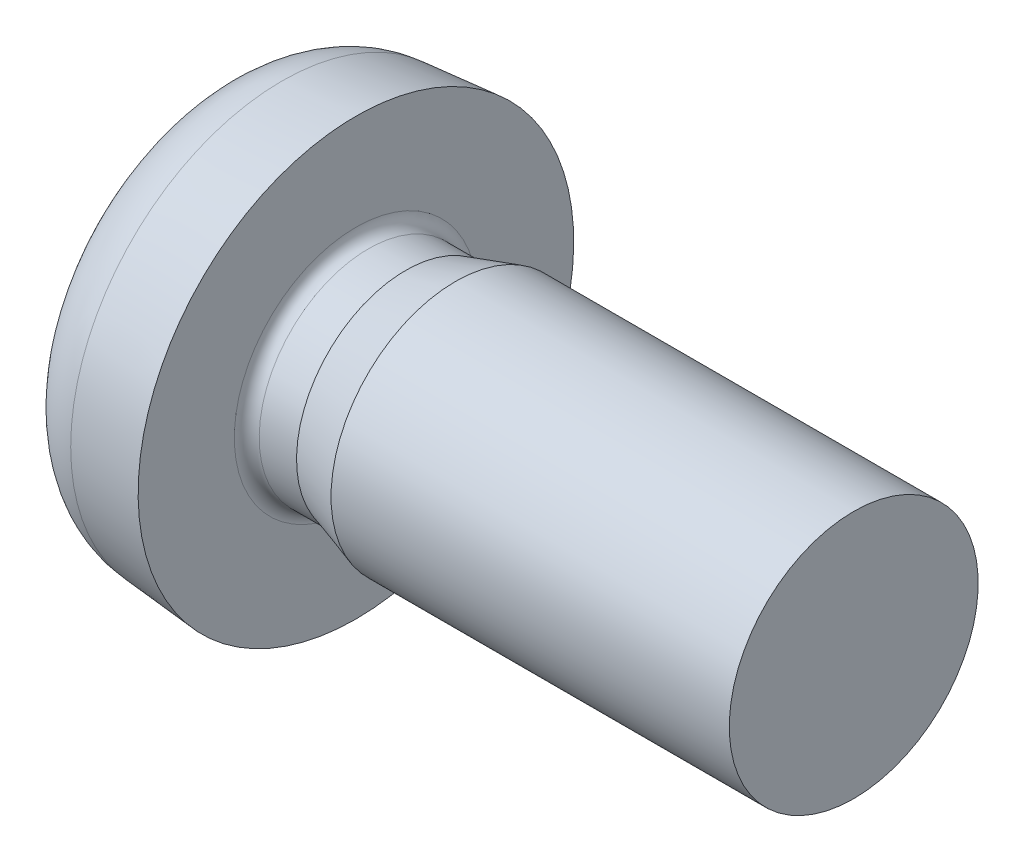
ISO-10303-21;
HEADER;
FILE_DESCRIPTION(('STEP AP214'),'2;1');
FILE_NAME('part.step','',(''),(''),'','','');
FILE_SCHEMA(('AUTOMOTIVE_DESIGN { 1 0 10303 214 1 1 1 1 }'));
ENDSEC;
DATA;
#1=APPLICATION_CONTEXT('core data for automotive mechanical design processes');
#2=APPLICATION_PROTOCOL_DEFINITION('international standard','automotive_design',2000,#1);
#3=PRODUCT_CONTEXT('',#1,'mechanical');
#4=PRODUCT('Part','Part','',(#3));
#5=PRODUCT_RELATED_PRODUCT_CATEGORY('part','',(#4));
#6=PRODUCT_DEFINITION_FORMATION('','',#4);
#7=PRODUCT_DEFINITION_CONTEXT('part definition',#1,'design');
#8=PRODUCT_DEFINITION('design','',#6,#7);
#9=PRODUCT_DEFINITION_SHAPE('','',#8);
#10=(LENGTH_UNIT() NAMED_UNIT(*) SI_UNIT(.MILLI.,.METRE.));
#11=(NAMED_UNIT(*) PLANE_ANGLE_UNIT() SI_UNIT($,.RADIAN.));
#12=(NAMED_UNIT(*) SI_UNIT($,.STERADIAN.) SOLID_ANGLE_UNIT());
#13=UNCERTAINTY_MEASURE_WITH_UNIT(LENGTH_MEASURE(1.E-05),#10,'distance_accuracy_value','');
#14=(GEOMETRIC_REPRESENTATION_CONTEXT(3) GLOBAL_UNCERTAINTY_ASSIGNED_CONTEXT((#13)) GLOBAL_UNIT_ASSIGNED_CONTEXT((#10,
#11,#12)) REPRESENTATION_CONTEXT('',''));
#15=CARTESIAN_POINT('',(0.,0.,0.));
#16=DIRECTION('',(0.,0.,1.));
#17=DIRECTION('',(1.,0.,0.));
#18=AXIS2_PLACEMENT_3D('',#15,#16,#17);
#19=CARTESIAN_POINT('',(-0.3,0.4,-0.23333333333333));
#20=DIRECTION('',(-1.,0.,0.));
#21=DIRECTION('',(0.,0.,1.));
#22=AXIS2_PLACEMENT_3D('',#19,#20,#21);
#23=PLANE('',#22);
#24=CARTESIAN_POINT('',(-0.3,0.,0.));
#25=DIRECTION('',(-1.,0.,0.));
#26=DIRECTION('',(0.,0.,1.));
#27=AXIS2_PLACEMENT_3D('',#24,#25,#26);
#28=CIRCLE('',#27,0.41489922506576);
#29=CARTESIAN_POINT('',(-0.300000000000007,0.110187871202621,0.400000000000005));
#30=VERTEX_POINT('',#29);
#31=CARTESIAN_POINT('',(-0.3,0.233333333333331,0.343069850782206));
#32=VERTEX_POINT('',#31);
#33=EDGE_CURVE('E434',#30,#32,#28,.T.);
#34=ORIENTED_EDGE('',*,*,#33,.F.);
#35=CARTESIAN_POINT('',(-0.299999999999999,0.233333333333331,0.400000000000001));
#36=DIRECTION('',(0.,-1.,0.));
#37=VECTOR('',#36,1.);
#38=LINE('',#35,#37);
#39=CARTESIAN_POINT('',(-0.3,0.233333333333332,0.4));
#40=VERTEX_POINT('',#39);
#41=EDGE_CURVE('E436',#40,#30,#38,.T.);
#42=ORIENTED_EDGE('',*,*,#41,.F.);
#43=CARTESIAN_POINT('',(-0.3,0.233333333333331,0.34306985078241));
#44=DIRECTION('',(0.,0.,1.));
#45=VECTOR('',#44,1.);
#46=LINE('',#43,#45);
#47=EDGE_CURVE('E437',#32,#40,#46,.T.);
#48=ORIENTED_EDGE('',*,*,#47,.F.);
#49=EDGE_LOOP('',(#34,#42,#48));
#50=FACE_BOUND('',#49,.T.);
#51=ADVANCED_FACE('F17',(#50),#23,.T.);
#52=CARTESIAN_POINT('',(-0.300000000000013,0.343069850782208,0.23333333333333));
#53=VERTEX_POINT('',#52);
#54=CARTESIAN_POINT('',(-0.3,0.400000000038284,0.11018787106366));
#55=VERTEX_POINT('',#54);
#56=EDGE_CURVE('E641',#53,#55,#28,.T.);
#57=ORIENTED_EDGE('',*,*,#56,.F.);
#58=CARTESIAN_POINT('',(-0.3,0.4,0.23333333333333));
#59=DIRECTION('',(0.,-1.,0.));
#60=VECTOR('',#59,1.);
#61=LINE('',#58,#60);
#62=CARTESIAN_POINT('',(-0.3,0.4,0.23333333333333));
#63=VERTEX_POINT('',#62);
#64=EDGE_CURVE('E533',#63,#53,#61,.T.);
#65=ORIENTED_EDGE('',*,*,#64,.F.);
#66=CARTESIAN_POINT('',(-0.300000000000001,0.400000000000001,0.110187871053114));
#67=DIRECTION('',(0.,0.,1.));
#68=VECTOR('',#67,1.);
#69=LINE('',#66,#68);
#70=EDGE_CURVE('E548',#55,#63,#69,.T.);
#71=ORIENTED_EDGE('',*,*,#70,.F.);
#72=EDGE_LOOP('',(#57,#65,#71));
#73=FACE_BOUND('',#72,.T.);
#74=ADVANCED_FACE('F424',(#73),#23,.T.);
#75=CARTESIAN_POINT('',(-0.300000000037748,0.400000000026424,-0.110187871119148));
#76=VERTEX_POINT('',#75);
#77=CARTESIAN_POINT('',(-0.3,0.343069850782207,-0.23333333333333));
#78=VERTEX_POINT('',#77);
#79=EDGE_CURVE('E642',#76,#78,#28,.T.);
#80=ORIENTED_EDGE('',*,*,#79,.F.);
#81=CARTESIAN_POINT('',(-0.300000000000001,0.400000000000001,-0.23333333333333));
#82=DIRECTION('',(0.,0.,1.));
#83=VECTOR('',#82,1.);
#84=LINE('',#81,#83);
#85=CARTESIAN_POINT('',(-0.3,0.4,-0.23333333333333));
#86=VERTEX_POINT('',#85);
#87=EDGE_CURVE('E541',#86,#76,#84,.T.);
#88=ORIENTED_EDGE('',*,*,#87,.F.);
#89=CARTESIAN_POINT('',(-0.3,0.343069850782207,-0.23333333333333));
#90=DIRECTION('',(0.,1.,0.));
#91=VECTOR('',#90,1.);
#92=LINE('',#89,#91);
#93=EDGE_CURVE('E317',#78,#86,#92,.T.);
#94=ORIENTED_EDGE('',*,*,#93,.F.);
#95=EDGE_LOOP('',(#80,#88,#94));
#96=FACE_BOUND('',#95,.T.);
#97=ADVANCED_FACE('F430',(#96),#23,.T.);
#98=CARTESIAN_POINT('',(-0.3,0.233333333333329,-0.343069850782208));
#99=VERTEX_POINT('',#98);
#100=CARTESIAN_POINT('',(-0.3,0.110187871202632,-0.4));
#101=VERTEX_POINT('',#100);
#102=EDGE_CURVE('E654',#99,#101,#28,.T.);
#103=ORIENTED_EDGE('',*,*,#102,.F.);
#104=CARTESIAN_POINT('',(-0.3,0.233333333333329,-0.400000000000001));
#105=DIRECTION('',(0.,0.,1.));
#106=VECTOR('',#105,1.);
#107=LINE('',#104,#106);
#108=CARTESIAN_POINT('',(-0.3,0.233333333333329,-0.4));
#109=VERTEX_POINT('',#108);
#110=EDGE_CURVE('E472',#109,#99,#107,.T.);
#111=ORIENTED_EDGE('',*,*,#110,.F.);
#112=CARTESIAN_POINT('',(-0.300000000000001,0.110187871202633,-0.400000000000002));
#113=DIRECTION('',(0.,1.,0.));
#114=VECTOR('',#113,1.);
#115=LINE('',#112,#114);
#116=EDGE_CURVE('E176',#101,#109,#115,.T.);
#117=ORIENTED_EDGE('',*,*,#116,.F.);
#118=EDGE_LOOP('',(#103,#111,#117));
#119=FACE_BOUND('',#118,.T.);
#120=ADVANCED_FACE('F659',(#119),#23,.T.);
#121=CARTESIAN_POINT('',(-0.3,-0.110187871202431,-0.400000000000056));
#122=VERTEX_POINT('',#121);
#123=CARTESIAN_POINT('',(-0.30000000000002,-0.233333333333332,-0.343069850782208));
#124=VERTEX_POINT('',#123);
#125=EDGE_CURVE('E591',#122,#124,#28,.T.);
#126=ORIENTED_EDGE('',*,*,#125,.F.);
#127=CARTESIAN_POINT('',(-0.300000000000001,-0.233333333333331,-0.400000000000001));
#128=DIRECTION('',(0.,1.,0.));
#129=VECTOR('',#128,1.);
#130=LINE('',#127,#129);
#131=CARTESIAN_POINT('',(-0.3,-0.233333333333332,-0.4));
#132=VERTEX_POINT('',#131);
#133=EDGE_CURVE('E589',#132,#122,#130,.T.);
#134=ORIENTED_EDGE('',*,*,#133,.F.);
#135=CARTESIAN_POINT('',(-0.3,-0.233333333333331,-0.343069850782409));
#136=DIRECTION('',(0.,0.,-1.));
#137=VECTOR('',#136,1.);
#138=LINE('',#135,#137);
#139=EDGE_CURVE('E177',#124,#132,#138,.T.);
#140=ORIENTED_EDGE('',*,*,#139,.F.);
#141=EDGE_LOOP('',(#126,#134,#140));
#142=FACE_BOUND('',#141,.T.);
#143=ADVANCED_FACE('F590',(#142),#23,.T.);
#144=CARTESIAN_POINT('',(-0.3,-0.343069850782207,-0.23333333333333));
#145=VERTEX_POINT('',#144);
#146=CARTESIAN_POINT('',(-0.300000000000011,-0.400000000000008,-0.11018787120261));
#147=VERTEX_POINT('',#146);
#148=EDGE_CURVE('E638',#145,#147,#28,.T.);
#149=ORIENTED_EDGE('',*,*,#148,.F.);
#150=CARTESIAN_POINT('',(-0.3,-0.4,-0.23333333333333));
#151=DIRECTION('',(0.,1.,0.));
#152=VECTOR('',#151,1.);
#153=LINE('',#150,#152);
#154=CARTESIAN_POINT('',(-0.3,-0.4,-0.23333333333333));
#155=VERTEX_POINT('',#154);
#156=EDGE_CURVE('E553',#155,#145,#153,.T.);
#157=ORIENTED_EDGE('',*,*,#156,.F.);
#158=CARTESIAN_POINT('',(-0.300000000000001,-0.400000000000001,-0.110187871053114));
#159=DIRECTION('',(0.,0.,-1.));
#160=VECTOR('',#159,1.);
#161=LINE('',#158,#160);
#162=EDGE_CURVE('E529',#147,#155,#161,.T.);
#163=ORIENTED_EDGE('',*,*,#162,.F.);
#164=EDGE_LOOP('',(#149,#157,#163));
#165=FACE_BOUND('',#164,.T.);
#166=ADVANCED_FACE('F750',(#165),#23,.T.);
#167=CARTESIAN_POINT('',(-0.3,-0.400000000000057,0.11018787120243));
#168=VERTEX_POINT('',#167);
#169=CARTESIAN_POINT('',(-0.30000000000002,-0.343069850782209,0.23333333333333));
#170=VERTEX_POINT('',#169);
#171=EDGE_CURVE('E619',#168,#170,#28,.T.);
#172=ORIENTED_EDGE('',*,*,#171,.F.);
#173=CARTESIAN_POINT('',(-0.300000000000001,-0.400000000000001,0.23333333333333));
#174=DIRECTION('',(0.,0.,-1.));
#175=VECTOR('',#174,1.);
#176=LINE('',#173,#175);
#177=CARTESIAN_POINT('',(-0.3,-0.4,0.23333333333333));
#178=VERTEX_POINT('',#177);
#179=EDGE_CURVE('E525',#178,#168,#176,.T.);
#180=ORIENTED_EDGE('',*,*,#179,.F.);
#181=CARTESIAN_POINT('',(-0.3,-0.343069850782207,0.23333333333333));
#182=DIRECTION('',(0.,-1.,0.));
#183=VECTOR('',#182,1.);
#184=LINE('',#181,#183);
#185=EDGE_CURVE('E535',#170,#178,#184,.T.);
#186=ORIENTED_EDGE('',*,*,#185,.F.);
#187=EDGE_LOOP('',(#172,#180,#186));
#188=FACE_BOUND('',#187,.T.);
#189=ADVANCED_FACE('F342',(#188),#23,.T.);
#190=CARTESIAN_POINT('',(0.271428571428572,0.,0.23333333333333));
#191=DIRECTION('',(0.,0.,1.));
#192=DIRECTION('',(1.,0.,0.));
#193=AXIS2_PLACEMENT_3D('',#190,#191,#192);
#194=PLANE('',#193);
#195=ORIENTED_EDGE('',*,*,#64,.T.);
#196=CARTESIAN_POINT('',(-0.2997,0.343038108403994,0.23333333333333));
#197=CARTESIAN_POINT('',(-0.426200518487948,0.356413169292468,0.23333333333333));
#198=CARTESIAN_POINT('',(-0.552724537571043,0.369562838851567,0.23333333333333));
#199=CARTESIAN_POINT('',(-0.805808804996358,0.395504275504335,0.23333333333333));
#200=CARTESIAN_POINT('',(-0.932369053194846,0.408296043998559,0.23333333333333));
#201=CARTESIAN_POINT('',(-1.13532721935039,0.428595006281568,0.23333333333333));
#202=CARTESIAN_POINT('',(-1.21171672944914,0.436186419234913,0.23333333333333));
#203=CARTESIAN_POINT('',(-1.28810992623331,0.44373980396504,0.23333333333333));
#204=B_SPLINE_CURVE_WITH_KNOTS('',3,(#196,#197,#198,#199,#200,#201,#202,#203),.UNSPECIFIED.,.F.,
.F.,(4,2,2,4),(0.,0.381616218749478,0.763230943932751,0.993528205938742),.UNSPECIFIED.);
#205=CARTESIAN_POINT('',(-1.27214147961395,0.442160764736997,0.23333333333333));
#206=VERTEX_POINT('',#205);
#207=EDGE_CURVE('E649',#53,#206,#204,.T.);
#208=ORIENTED_EDGE('',*,*,#207,.T.);
#209=CARTESIAN_POINT('',(3.19999999999751,0.,0.23333333333333));
#210=DIRECTION('',(0.,0.,1.));
#211=DIRECTION('',(1.,0.,0.));
#212=AXIS2_PLACEMENT_3D('',#209,#210,#211);
#213=CIRCLE('',#212,4.49394654569168);
#214=CARTESIAN_POINT('',(-1.17792712457823,1.01454898720476,0.23333333333333));
#215=VERTEX_POINT('',#214);
#216=EDGE_CURVE('E492',#215,#206,#213,.T.);
#217=ORIENTED_EDGE('',*,*,#216,.F.);
#218=DIRECTION('',(-0.81923192051904,0.573462344363328,0.));
#219=VECTOR('',#218,1.);
#220=CARTESIAN_POINT('',(-0.3,0.4,0.23333333333333));
#221=LINE('',#220,#219);
#222=EDGE_CURVE('E556',#63,#215,#221,.T.);
#223=ORIENTED_EDGE('',*,*,#222,.F.);
#224=EDGE_LOOP('',(#195,#208,#217,#223));
#225=FACE_BOUND('',#224,.T.);
#226=ADVANCED_FACE('F661',(#225),#194,.F.);
#227=CARTESIAN_POINT('',(0.271428571428572,0.,-0.23333333333333));
#228=DIRECTION('',(0.,0.,-1.));
#229=DIRECTION('',(-1.,0.,0.));
#230=AXIS2_PLACEMENT_3D('',#227,#228,#229);
#231=PLANE('',#230);
#232=CARTESIAN_POINT('',(3.19999999999751,0.,-0.23333333333333));
#233=DIRECTION('',(0.,0.,-1.));
#234=DIRECTION('',(-1.,0.,0.));
#235=AXIS2_PLACEMENT_3D('',#232,#233,#234);
#236=CIRCLE('',#235,4.49394654569168);
#237=CARTESIAN_POINT('',(-1.27214147961393,0.442160764737084,-0.23333333333333));
#238=VERTEX_POINT('',#237);
#239=CARTESIAN_POINT('',(-1.17792712457823,1.01454898720476,-0.23333333333333));
#240=VERTEX_POINT('',#239);
#241=EDGE_CURVE('E499',#238,#240,#236,.T.);
#242=ORIENTED_EDGE('',*,*,#241,.F.);
#243=CARTESIAN_POINT('',(-1.28810992623331,0.44373980396504,-0.23333333333333));
#244=CARTESIAN_POINT('',(-1.20571743140864,0.435594808395287,-0.23333333333333));
#245=CARTESIAN_POINT('',(-1.12332951598812,0.427403221854397,-0.23333333333333));
#246=CARTESIAN_POINT('',(-0.958565391565636,0.410905577220105,-0.23333333333333));
#247=CARTESIAN_POINT('',(-0.876189182530653,0.402599519456286,-0.23333333333333));
#248=CARTESIAN_POINT('',(-0.711450476951214,0.385851589291033,-0.23333333333333));
#249=CARTESIAN_POINT('',(-0.629087980417993,0.37740971677886,-0.23333333333333));
#250=CARTESIAN_POINT('',(-0.464380151721125,0.360357960412237,-0.23333333333333));
#251=CARTESIAN_POINT('',(-0.38203481960775,0.351748076072497,-0.23333333333333));
#252=CARTESIAN_POINT('',(-0.299699999999289,0.343038108411188,-0.23333333333333));
#253=B_SPLINE_CURVE_WITH_KNOTS('',3,(#243,#244,#245,#246,#247,#248,#249,#250,#251,#252),
.UNSPECIFIED.,.F.,.F.,(4,2,2,2,4),(0.,0.248382344578916,0.496763974168754,0.7451458062906,
0.99352835595135),.UNSPECIFIED.);
#254=EDGE_CURVE('E278',#238,#78,#253,.T.);
#255=ORIENTED_EDGE('',*,*,#254,.T.);
#256=ORIENTED_EDGE('',*,*,#93,.T.);
#257=DIRECTION('',(-0.81923192051904,0.573462344363328,0.));
#258=VECTOR('',#257,1.);
#259=CARTESIAN_POINT('',(-0.3,0.4,-0.23333333333333));
#260=LINE('',#259,#258);
#261=EDGE_CURVE('E557',#86,#240,#260,.T.);
#262=ORIENTED_EDGE('',*,*,#261,.T.);
#263=EDGE_LOOP('',(#242,#255,#256,#262));
#264=FACE_BOUND('',#263,.T.);
#265=ADVANCED_FACE('F289',(#264),#231,.F.);
#266=CARTESIAN_POINT('',(3.19999999999751,0.,0.));
#267=DIRECTION('',(-1.,0.,0.));
#268=DIRECTION('',(0.,1.,0.));
#269=AXIS2_PLACEMENT_3D('',#266,#267,#268);
#270=SPHERICAL_SURFACE('',#269,4.49999999999762);
#271=CARTESIAN_POINT('',(3.19999999999751,0.23333333333333,0.));
#272=DIRECTION('',(0.,1.,0.));
#273=DIRECTION('',(0.,0.,1.));
#274=AXIS2_PLACEMENT_3D('',#271,#272,#273);
#275=CIRCLE('',#274,4.49394654569168);
#276=CARTESIAN_POINT('',(-1.17792712457823,0.233333333333327,-1.01454898720476));
#277=VERTEX_POINT('',#276);
#278=CARTESIAN_POINT('',(-1.27214147961395,0.233333333333329,-0.442160764736998));
#279=VERTEX_POINT('',#278);
#280=EDGE_CURVE('E598',#277,#279,#275,.T.);
#281=ORIENTED_EDGE('',*,*,#280,.T.);
#282=CARTESIAN_POINT('',(-1.27214147961395,0.,0.));
#283=DIRECTION('',(1.,0.,0.));
#284=DIRECTION('',(0.,0.,-1.));
#285=AXIS2_PLACEMENT_3D('',#282,#283,#284);
#286=CIRCLE('',#285,0.499950583875296);
#287=EDGE_CURVE('E644',#279,#238,#286,.T.);
#288=ORIENTED_EDGE('',*,*,#287,.T.);
#289=ORIENTED_EDGE('',*,*,#241,.T.);
#290=CARTESIAN_POINT('',(2.23691275167617,-1.37583892617332,0.));
#291=DIRECTION('',(0.573462344363328,0.819231920519041,0.));
#292=DIRECTION('',(-0.81923192051904,0.573462344363328,0.));
#293=AXIS2_PLACEMENT_3D('',#290,#291,#292);
#294=CIRCLE('',#293,4.17486888432747);
#295=EDGE_CURVE('E489',#240,#215,#294,.T.);
#296=ORIENTED_EDGE('',*,*,#295,.T.);
#297=ORIENTED_EDGE('',*,*,#216,.T.);
#298=CARTESIAN_POINT('',(-1.27214147961393,0.233333333333332,0.442160764737084));
#299=VERTEX_POINT('',#298);
#300=EDGE_CURVE('E622',#206,#299,#286,.T.);
#301=ORIENTED_EDGE('',*,*,#300,.T.);
#302=CARTESIAN_POINT('',(-1.17792712457823,0.233333333333334,1.01454898720476));
#303=VERTEX_POINT('',#302);
#304=EDGE_CURVE('E602',#299,#303,#275,.T.);
#305=ORIENTED_EDGE('',*,*,#304,.T.);
#306=CARTESIAN_POINT('',(2.23691275167617,0.,-1.37583892617332));
#307=DIRECTION('',(0.573462344363328,0.,0.819231920519041));
#308=DIRECTION('',(0.819231920519041,0.,-0.573462344363328));
#309=AXIS2_PLACEMENT_3D('',#306,#307,#308);
#310=CIRCLE('',#309,4.17486888432747);
#311=CARTESIAN_POINT('',(-1.17792712457823,-0.233333333333327,1.01454898720476));
#312=VERTEX_POINT('',#311);
#313=EDGE_CURVE('E486',#303,#312,#310,.T.);
#314=ORIENTED_EDGE('',*,*,#313,.T.);
#315=CARTESIAN_POINT('',(3.19999999999751,-0.23333333333333,0.));
#316=DIRECTION('',(0.,-1.,0.));
#317=DIRECTION('',(0.,0.,-1.));
#318=AXIS2_PLACEMENT_3D('',#315,#316,#317);
#319=CIRCLE('',#318,4.49394654569168);
#320=CARTESIAN_POINT('',(-1.27214147961403,-0.233333333333329,0.442160764736266));
#321=VERTEX_POINT('',#320);
#322=EDGE_CURVE('E601',#312,#321,#319,.T.);
#323=ORIENTED_EDGE('',*,*,#322,.T.);
#324=CARTESIAN_POINT('',(-1.27214147961395,-0.442160764736998,0.23333333333333));
#325=VERTEX_POINT('',#324);
#326=EDGE_CURVE('E35',#321,#325,#286,.T.);
#327=ORIENTED_EDGE('',*,*,#326,.T.);
#328=CARTESIAN_POINT('',(-1.17792712457823,-1.01454898720476,0.23333333333333));
#329=VERTEX_POINT('',#328);
#330=EDGE_CURVE('E495',#325,#329,#213,.T.);
#331=ORIENTED_EDGE('',*,*,#330,.T.);
#332=CARTESIAN_POINT('',(2.23691275167617,1.37583892617332,0.));
#333=DIRECTION('',(0.573462344363328,-0.819231920519041,0.));
#334=DIRECTION('',(0.81923192051904,0.573462344363328,0.));
#335=AXIS2_PLACEMENT_3D('',#332,#333,#334);
#336=CIRCLE('',#335,4.17486888432747);
#337=CARTESIAN_POINT('',(-1.17792712457823,-1.01454898720476,-0.23333333333333));
#338=VERTEX_POINT('',#337);
#339=EDGE_CURVE('E500',#329,#338,#336,.T.);
#340=ORIENTED_EDGE('',*,*,#339,.T.);
#341=CARTESIAN_POINT('',(-1.27214147961393,-0.442160764737084,-0.23333333333333));
#342=VERTEX_POINT('',#341);
#343=EDGE_CURVE('E496',#338,#342,#236,.T.);
#344=ORIENTED_EDGE('',*,*,#343,.T.);
#345=CARTESIAN_POINT('',(-1.27214147961395,-0.233333333333332,-0.442160764736996));
#346=VERTEX_POINT('',#345);
#347=EDGE_CURVE('E600',#342,#346,#286,.T.);
#348=ORIENTED_EDGE('',*,*,#347,.T.);
#349=CARTESIAN_POINT('',(-1.17792712457823,-0.233333333333334,-1.01454898720476));
#350=VERTEX_POINT('',#349);
#351=EDGE_CURVE('E186',#346,#350,#319,.T.);
#352=ORIENTED_EDGE('',*,*,#351,.T.);
#353=CARTESIAN_POINT('',(2.23691275167617,0.,1.37583892617332));
#354=DIRECTION('',(0.573462344363329,0.,-0.819231920519041));
#355=DIRECTION('',(-0.819231920519041,0.,-0.573462344363329));
#356=AXIS2_PLACEMENT_3D('',#353,#354,#355);
#357=CIRCLE('',#356,4.17486888432747);
#358=EDGE_CURVE('E27',#350,#277,#357,.T.);
#359=ORIENTED_EDGE('',*,*,#358,.T.);
#360=EDGE_LOOP('',(#281,#288,#289,#296,#297,#301,#305,#314,#323,#327,#331,#340,#344,#348,#352,#359));
#361=FACE_BOUND('',#360,.T.);
#362=CARTESIAN_POINT('',(-1.1171858241993,0.,0.));
#363=DIRECTION('',(-1.,0.,0.));
#364=DIRECTION('',(0.,-1.,0.));
#365=AXIS2_PLACEMENT_3D('',#362,#363,#364);
#366=CIRCLE('',#365,1.2696088213827);
#367=CARTESIAN_POINT('',(-1.1171858241993,-1.2696088213827,0.));
#368=VERTEX_POINT('',#367);
#369=EDGE_CURVE('E503',#368,#368,#366,.T.);
#370=ORIENTED_EDGE('',*,*,#369,.T.);
#371=EDGE_LOOP('',(#370));
#372=FACE_BOUND('',#371,.T.);
#373=ADVANCED_FACE('F19',(#361,#372),#270,.T.);
#374=CARTESIAN_POINT('',(-0.541561047639255,0.,0.));
#375=DIRECTION('',(-1.,0.,0.));
#376=DIRECTION('',(0.,-1.,0.));
#377=AXIS2_PLACEMENT_3D('',#374,#375,#376);
#378=TOROIDAL_SURFACE('',#377,1.10032764519818,0.600000000000179);
#379=ORIENTED_EDGE('',*,*,#369,.F.);
#380=EDGE_LOOP('',(#379));
#381=FACE_BOUND('',#380,.T.);
#382=CARTESIAN_POINT('',(-0.593854493287836,0.,0.));
#383=DIRECTION('',(-1.,0.,0.));
#384=DIRECTION('',(0.,-1.,0.));
#385=AXIS2_PLACEMENT_3D('',#382,#383,#384);
#386=CIRCLE('',#385,1.69804446405341);
#387=CARTESIAN_POINT('',(-0.593854493287836,-1.69804446405342,0.));
#388=VERTEX_POINT('',#387);
#389=EDGE_CURVE('E506',#388,#388,#386,.T.);
#390=ORIENTED_EDGE('',*,*,#389,.T.);
#391=EDGE_LOOP('',(#390));
#392=FACE_BOUND('',#391,.T.);
#393=ADVANCED_FACE('F733',(#381,#392),#378,.T.);
#394=CARTESIAN_POINT('',(0.,0.,0.));
#395=DIRECTION('',(1.,0.,0.));
#396=DIRECTION('',(0.,1.,0.));
#397=AXIS2_PLACEMENT_3D('',#394,#395,#396);
#398=CONICAL_SURFACE('',#397,1.75,0.0872664625996655);
#399=ORIENTED_EDGE('',*,*,#389,.F.);
#400=EDGE_LOOP('',(#399));
#401=FACE_BOUND('',#400,.T.);
#402=CARTESIAN_POINT('',(0.,0.,0.));
#403=DIRECTION('',(-1.,0.,0.));
#404=DIRECTION('',(0.,-1.,0.));
#405=AXIS2_PLACEMENT_3D('',#402,#403,#404);
#406=CIRCLE('',#405,1.75);
#407=CARTESIAN_POINT('',(0.,-1.75,0.));
#408=VERTEX_POINT('',#407);
#409=EDGE_CURVE('E509',#408,#408,#406,.T.);
#410=ORIENTED_EDGE('',*,*,#409,.T.);
#411=EDGE_LOOP('',(#410));
#412=FACE_BOUND('',#411,.T.);
#413=ADVANCED_FACE('F756',(#401,#412),#398,.T.);
#414=CARTESIAN_POINT('',(0.,1.75,0.));
#415=DIRECTION('',(-1.,0.,0.));
#416=DIRECTION('',(0.,-1.,0.));
#417=AXIS2_PLACEMENT_3D('',#414,#415,#416);
#418=PLANE('',#417);
#419=ORIENTED_EDGE('',*,*,#409,.F.);
#420=EDGE_LOOP('',(#419));
#421=FACE_BOUND('',#420,.T.);
#422=CARTESIAN_POINT('',(0.,0.,0.));
#423=DIRECTION('',(-1.,0.,0.));
#424=DIRECTION('',(0.,-1.,0.));
#425=AXIS2_PLACEMENT_3D('',#422,#423,#424);
#426=CIRCLE('',#425,0.977250000000021);
#427=CARTESIAN_POINT('',(0.,-0.977250000000022,0.));
#428=VERTEX_POINT('',#427);
#429=EDGE_CURVE('E512',#428,#428,#426,.T.);
#430=ORIENTED_EDGE('',*,*,#429,.T.);
#431=EDGE_LOOP('',(#430));
#432=FACE_BOUND('',#431,.T.);
#433=ADVANCED_FACE('F763',(#421,#432),#418,.F.);
#434=CARTESIAN_POINT('',(0.0999999999999905,0.,0.));
#435=DIRECTION('',(-1.,0.,0.));
#436=DIRECTION('',(0.,-1.,0.));
#437=AXIS2_PLACEMENT_3D('',#434,#435,#436);
#438=TOROIDAL_SURFACE('',#437,0.977250000000011,0.0999999999999904);
#439=ORIENTED_EDGE('',*,*,#429,.F.);
#440=EDGE_LOOP('',(#439));
#441=FACE_BOUND('',#440,.T.);
#442=CARTESIAN_POINT('',(0.0999999999999981,0.,0.));
#443=DIRECTION('',(-1.,0.,0.));
#444=DIRECTION('',(0.,-1.,0.));
#445=AXIS2_PLACEMENT_3D('',#442,#443,#444);
#446=CIRCLE('',#445,0.877250000000021);
#447=CARTESIAN_POINT('',(0.0999999999999982,-0.877250000000022,0.));
#448=VERTEX_POINT('',#447);
#449=EDGE_CURVE('E515',#448,#448,#446,.T.);
#450=ORIENTED_EDGE('',*,*,#449,.T.);
#451=EDGE_LOOP('',(#450));
#452=FACE_BOUND('',#451,.T.);
#453=ADVANCED_FACE('F771',(#441,#452),#438,.F.);
#454=CARTESIAN_POINT('',(4.,0.,0.));
#455=DIRECTION('',(-1.,0.,0.));
#456=DIRECTION('',(0.,-1.,0.));
#457=AXIS2_PLACEMENT_3D('',#454,#455,#456);
#458=CYLINDRICAL_SURFACE('',#457,0.877250000000016);
#459=ORIENTED_EDGE('',*,*,#449,.F.);
#460=EDGE_LOOP('',(#459));
#461=FACE_BOUND('',#460,.T.);
#462=CARTESIAN_POINT('',(0.40000000000002,0.,0.));
#463=DIRECTION('',(-1.,0.,0.));
#464=DIRECTION('',(0.,-1.,0.));
#465=AXIS2_PLACEMENT_3D('',#462,#463,#464);
#466=CIRCLE('',#465,0.877250000000011);
#467=CARTESIAN_POINT('',(0.40000000000002,-0.877250000000012,0.));
#468=VERTEX_POINT('',#467);
#469=EDGE_CURVE('E518',#468,#468,#466,.T.);
#470=ORIENTED_EDGE('',*,*,#469,.T.);
#471=EDGE_LOOP('',(#470));
#472=FACE_BOUND('',#471,.T.);
#473=ADVANCED_FACE('F779',(#461,#472),#458,.T.);
#474=CARTESIAN_POINT('',(0.8,0.,0.));
#475=DIRECTION('',(1.,0.,0.));
#476=DIRECTION('',(0.,1.,0.));
#477=AXIS2_PLACEMENT_3D('',#474,#475,#476);
#478=CONICAL_SURFACE('',#477,1.,0.297752138542782);
#479=ORIENTED_EDGE('',*,*,#469,.F.);
#480=EDGE_LOOP('',(#479));
#481=FACE_BOUND('',#480,.T.);
#482=CARTESIAN_POINT('',(0.8,0.,0.));
#483=DIRECTION('',(-1.,0.,0.));
#484=DIRECTION('',(0.,-1.,0.));
#485=AXIS2_PLACEMENT_3D('',#482,#483,#484);
#486=CIRCLE('',#485,1.);
#487=CARTESIAN_POINT('',(0.8,-1.,0.));
#488=VERTEX_POINT('',#487);
#489=EDGE_CURVE('E520',#488,#488,#486,.T.);
#490=ORIENTED_EDGE('',*,*,#489,.T.);
#491=EDGE_LOOP('',(#490));
#492=FACE_BOUND('',#491,.T.);
#493=ADVANCED_FACE('F787',(#481,#492),#478,.T.);
#494=CARTESIAN_POINT('',(4.,0.,0.));
#495=DIRECTION('',(-1.,0.,0.));
#496=DIRECTION('',(0.,-1.,0.));
#497=AXIS2_PLACEMENT_3D('',#494,#495,#496);
#498=CYLINDRICAL_SURFACE('',#497,1.);
#499=ORIENTED_EDGE('',*,*,#489,.F.);
#500=EDGE_LOOP('',(#499));
#501=FACE_BOUND('',#500,.T.);
#502=CARTESIAN_POINT('',(4.,0.,0.));
#503=DIRECTION('',(-1.,0.,0.));
#504=DIRECTION('',(0.,-1.,0.));
#505=AXIS2_PLACEMENT_3D('',#502,#503,#504);
#506=CIRCLE('',#505,1.);
#507=CARTESIAN_POINT('',(4.,-1.,0.));
#508=VERTEX_POINT('',#507);
#509=EDGE_CURVE('E331',#508,#508,#506,.T.);
#510=ORIENTED_EDGE('',*,*,#509,.T.);
#511=EDGE_LOOP('',(#510));
#512=FACE_BOUND('',#511,.T.);
#513=ADVANCED_FACE('F795',(#501,#512),#498,.T.);
#514=CARTESIAN_POINT('',(4.,1.,0.));
#515=DIRECTION('',(-1.,0.,0.));
#516=DIRECTION('',(0.,-1.,0.));
#517=AXIS2_PLACEMENT_3D('',#514,#515,#516);
#518=PLANE('',#517);
#519=ORIENTED_EDGE('',*,*,#509,.F.);
#520=EDGE_LOOP('',(#519));
#521=FACE_BOUND('',#520,.T.);
#522=ADVANCED_FACE('F726',(#521),#518,.F.);
#523=CARTESIAN_POINT('',(-1.3,1.1,-0.23333333333333));
#524=DIRECTION('',(0.573462344363328,0.819231920519041,0.));
#525=DIRECTION('',(-0.81923192051904,0.573462344363328,0.));
#526=AXIS2_PLACEMENT_3D('',#523,#524,#525);
#527=PLANE('',#526);
#528=ORIENTED_EDGE('',*,*,#87,.T.);
#529=CARTESIAN_POINT('',(0.205241374074472,0.0463310381478698,0.));
#530=DIRECTION('',(0.573462344363328,0.819231920519041,0.));
#531=DIRECTION('',(-0.819231920519041,0.573462344363328,0.));
#532=AXIS2_PLACEMENT_3D('',#529,#530,#531);
#533=ELLIPSE('',#532,0.64641791415536,0.367789621693797);
#534=EDGE_CURVE('E643',#76,#55,#533,.T.);
#535=ORIENTED_EDGE('',*,*,#534,.T.);
#536=ORIENTED_EDGE('',*,*,#70,.T.);
#537=ORIENTED_EDGE('',*,*,#222,.T.);
#538=ORIENTED_EDGE('',*,*,#295,.F.);
#539=ORIENTED_EDGE('',*,*,#261,.F.);
#540=EDGE_LOOP('',(#528,#535,#536,#537,#538,#539));
#541=FACE_BOUND('',#540,.T.);
#542=ADVANCED_FACE('F343',(#541),#527,.F.);
#543=ORIENTED_EDGE('',*,*,#330,.F.);
#544=CARTESIAN_POINT('',(-1.28810992623331,-0.44373980396504,0.23333333333333));
#545=CARTESIAN_POINT('',(-1.20571743140864,-0.435594808395286,0.23333333333333));
#546=CARTESIAN_POINT('',(-1.12332951598812,-0.427403221854397,0.23333333333333));
#547=CARTESIAN_POINT('',(-0.958565391565636,-0.410905577220105,0.23333333333333));
#548=CARTESIAN_POINT('',(-0.876189182530653,-0.402599519456286,0.23333333333333));
#549=CARTESIAN_POINT('',(-0.711450476951214,-0.385851589291033,0.23333333333333));
#550=CARTESIAN_POINT('',(-0.629087980417993,-0.37740971677886,0.23333333333333));
#551=CARTESIAN_POINT('',(-0.464380151721125,-0.360357960412237,0.23333333333333));
#552=CARTESIAN_POINT('',(-0.38203481960775,-0.351748076072497,0.23333333333333));
#553=CARTESIAN_POINT('',(-0.299699999999289,-0.343038108411188,0.23333333333333));
#554=B_SPLINE_CURVE_WITH_KNOTS('',3,(#544,#545,#546,#547,#548,#549,#550,#551,#552,#553),
.UNSPECIFIED.,.F.,.F.,(4,2,2,2,4),(0.,0.248382344578916,0.496763974168754,0.7451458062906,
0.99352835595135),.UNSPECIFIED.);
#555=EDGE_CURVE('E439',#325,#170,#554,.T.);
#556=ORIENTED_EDGE('',*,*,#555,.T.);
#557=ORIENTED_EDGE('',*,*,#185,.T.);
#558=DIRECTION('',(-0.81923192051904,-0.573462344363328,0.));
#559=VECTOR('',#558,1.);
#560=CARTESIAN_POINT('',(-0.3,-0.4,0.23333333333333));
#561=LINE('',#560,#559);
#562=EDGE_CURVE('E603',#178,#329,#561,.T.);
#563=ORIENTED_EDGE('',*,*,#562,.T.);
#564=EDGE_LOOP('',(#543,#556,#557,#563));
#565=FACE_BOUND('',#564,.T.);
#566=ADVANCED_FACE('F287',(#565),#194,.F.);
#567=ORIENTED_EDGE('',*,*,#156,.T.);
#568=CARTESIAN_POINT('',(-0.2997,-0.343038108403994,-0.23333333333333));
#569=CARTESIAN_POINT('',(-0.426200518487948,-0.356413169292469,-0.23333333333333));
#570=CARTESIAN_POINT('',(-0.552724537571043,-0.369562838851567,-0.23333333333333));
#571=CARTESIAN_POINT('',(-0.805808804996358,-0.395504275504335,-0.23333333333333));
#572=CARTESIAN_POINT('',(-0.932369053194846,-0.408296043998559,-0.23333333333333));
#573=CARTESIAN_POINT('',(-1.13532721935039,-0.428595006281567,-0.23333333333333));
#574=CARTESIAN_POINT('',(-1.21171672944914,-0.436186419234912,-0.23333333333333));
#575=CARTESIAN_POINT('',(-1.28810992623331,-0.44373980396504,-0.23333333333333));
#576=B_SPLINE_CURVE_WITH_KNOTS('',3,(#568,#569,#570,#571,#572,#573,#574,#575),.UNSPECIFIED.,.F.,
.F.,(4,2,2,4),(0.,0.381616218749478,0.763230943932751,0.993528205938742),.UNSPECIFIED.);
#577=EDGE_CURVE('E647',#145,#342,#576,.T.);
#578=ORIENTED_EDGE('',*,*,#577,.T.);
#579=ORIENTED_EDGE('',*,*,#343,.F.);
#580=DIRECTION('',(-0.81923192051904,-0.573462344363328,0.));
#581=VECTOR('',#580,1.);
#582=CARTESIAN_POINT('',(-0.3,-0.4,-0.23333333333333));
#583=LINE('',#582,#581);
#584=EDGE_CURVE('E42',#155,#338,#583,.T.);
#585=ORIENTED_EDGE('',*,*,#584,.F.);
#586=EDGE_LOOP('',(#567,#578,#579,#585));
#587=FACE_BOUND('',#586,.T.);
#588=ADVANCED_FACE('F282',(#587),#231,.F.);
#589=CARTESIAN_POINT('',(-1.3,-1.1,0.23333333333333));
#590=DIRECTION('',(0.573462344363328,-0.819231920519041,0.));
#591=DIRECTION('',(0.81923192051904,0.573462344363328,0.));
#592=AXIS2_PLACEMENT_3D('',#589,#590,#591);
#593=PLANE('',#592);
#594=ORIENTED_EDGE('',*,*,#179,.T.);
#595=CARTESIAN_POINT('',(0.205241374074472,-0.0463310381478698,0.));
#596=DIRECTION('',(0.573462344363328,-0.819231920519041,0.));
#597=DIRECTION('',(-0.819231920519041,-0.573462344363328,0.));
#598=AXIS2_PLACEMENT_3D('',#595,#596,#597);
#599=ELLIPSE('',#598,0.64641791415536,0.367789621693797);
#600=EDGE_CURVE('E620',#168,#147,#599,.T.);
#601=ORIENTED_EDGE('',*,*,#600,.T.);
#602=ORIENTED_EDGE('',*,*,#162,.T.);
#603=ORIENTED_EDGE('',*,*,#584,.T.);
#604=ORIENTED_EDGE('',*,*,#339,.F.);
#605=ORIENTED_EDGE('',*,*,#562,.F.);
#606=EDGE_LOOP('',(#594,#601,#602,#603,#604,#605));
#607=FACE_BOUND('',#606,.T.);
#608=ADVANCED_FACE('F286',(#607),#593,.F.);
#609=CARTESIAN_POINT('',(-0.300000000000013,-0.233333333333329,0.343069850782209));
#610=VERTEX_POINT('',#609);
#611=CARTESIAN_POINT('',(-0.3,-0.110187871063659,0.400000000038284));
#612=VERTEX_POINT('',#611);
#613=EDGE_CURVE('E156',#610,#612,#28,.T.);
#614=ORIENTED_EDGE('',*,*,#613,.F.);
#615=CARTESIAN_POINT('',(-0.3,-0.233333333333329,0.400000000000001));
#616=DIRECTION('',(0.,0.,-1.));
#617=VECTOR('',#616,1.);
#618=LINE('',#615,#617);
#619=CARTESIAN_POINT('',(-0.3,-0.233333333333329,0.4));
#620=VERTEX_POINT('',#619);
#621=EDGE_CURVE('E165',#620,#610,#618,.T.);
#622=ORIENTED_EDGE('',*,*,#621,.F.);
#623=CARTESIAN_POINT('',(-0.299999999999999,-0.110187871202602,0.400000000000002));
#624=DIRECTION('',(0.,-1.,0.));
#625=VECTOR('',#624,1.);
#626=LINE('',#623,#625);
#627=EDGE_CURVE('E168',#612,#620,#626,.T.);
#628=ORIENTED_EDGE('',*,*,#627,.F.);
#629=EDGE_LOOP('',(#614,#622,#628));
#630=FACE_BOUND('',#629,.T.);
#631=ADVANCED_FACE('F164',(#630),#23,.T.);
#632=CARTESIAN_POINT('',(0.271428571428572,0.23333333333333,0.));
#633=DIRECTION('',(0.,1.,0.));
#634=DIRECTION('',(1.,0.,0.));
#635=AXIS2_PLACEMENT_3D('',#632,#633,#634);
#636=PLANE('',#635);
#637=ORIENTED_EDGE('',*,*,#110,.T.);
#638=CARTESIAN_POINT('',(-0.2997,0.233333333333329,-0.343038108403995));
#639=CARTESIAN_POINT('',(-0.426200518487948,0.233333333333329,-0.356413169292469));
#640=CARTESIAN_POINT('',(-0.552724537571044,0.233333333333329,-0.369562838851568));
#641=CARTESIAN_POINT('',(-0.805808804996358,0.233333333333329,-0.395504275504336));
#642=CARTESIAN_POINT('',(-0.932369053194846,0.233333333333329,-0.40829604399856));
#643=CARTESIAN_POINT('',(-1.13532721935039,0.233333333333328,-0.428595006281568));
#644=CARTESIAN_POINT('',(-1.21171672944914,0.233333333333328,-0.436186419234913));
#645=CARTESIAN_POINT('',(-1.28810992623331,0.233333333333329,-0.443739803965042));
#646=B_SPLINE_CURVE_WITH_KNOTS('',3,(#638,#639,#640,#641,#642,#643,#644,#645),.UNSPECIFIED.,.F.,
.F.,(4,2,2,4),(0.,0.381616218749478,0.763230943932751,0.993528205938742),.UNSPECIFIED.);
#647=EDGE_CURVE('E462',#99,#279,#646,.T.);
#648=ORIENTED_EDGE('',*,*,#647,.T.);
#649=ORIENTED_EDGE('',*,*,#280,.F.);
#650=DIRECTION('',(-0.81923192051904,0.,-0.573462344363328));
#651=VECTOR('',#650,1.);
#652=CARTESIAN_POINT('',(-0.3,0.233333333333329,-0.4));
#653=LINE('',#652,#651);
#654=EDGE_CURVE('E588',#109,#277,#653,.T.);
#655=ORIENTED_EDGE('',*,*,#654,.F.);
#656=EDGE_LOOP('',(#637,#648,#649,#655));
#657=FACE_BOUND('',#656,.T.);
#658=ADVANCED_FACE('F341',(#657),#636,.F.);
#659=CARTESIAN_POINT('',(0.271428571428572,-0.23333333333333,0.));
#660=DIRECTION('',(0.,-1.,0.));
#661=DIRECTION('',(-1.,0.,0.));
#662=AXIS2_PLACEMENT_3D('',#659,#660,#661);
#663=PLANE('',#662);
#664=ORIENTED_EDGE('',*,*,#351,.F.);
#665=CARTESIAN_POINT('',(-1.28810992623331,-0.233333333333332,-0.44373980396504));
#666=CARTESIAN_POINT('',(-1.20571743140864,-0.233333333333332,-0.435594808395286));
#667=CARTESIAN_POINT('',(-1.12332951598812,-0.233333333333332,-0.427403221854396));
#668=CARTESIAN_POINT('',(-0.958565391565636,-0.233333333333332,-0.410905577220104));
#669=CARTESIAN_POINT('',(-0.876189182530653,-0.233333333333332,-0.402599519456285));
#670=CARTESIAN_POINT('',(-0.711450476951214,-0.233333333333331,-0.385851589291032));
#671=CARTESIAN_POINT('',(-0.629087980417993,-0.233333333333331,-0.377409716778859));
#672=CARTESIAN_POINT('',(-0.464380151721125,-0.233333333333331,-0.360357960412236));
#673=CARTESIAN_POINT('',(-0.38203481960775,-0.233333333333331,-0.351748076072496));
#674=CARTESIAN_POINT('',(-0.299699999999289,-0.233333333333332,-0.343038108411188));
#675=B_SPLINE_CURVE_WITH_KNOTS('',3,(#665,#666,#667,#668,#669,#670,#671,#672,#673,#674),
.UNSPECIFIED.,.F.,.F.,(4,2,2,2,4),(0.,0.248382344578916,0.496763974168754,0.745145806290599,
0.99352835595135),.UNSPECIFIED.);
#676=EDGE_CURVE('E587',#346,#124,#675,.T.);
#677=ORIENTED_EDGE('',*,*,#676,.T.);
#678=ORIENTED_EDGE('',*,*,#139,.T.);
#679=DIRECTION('',(-0.81923192051904,0.,-0.573462344363328));
#680=VECTOR('',#679,1.);
#681=CARTESIAN_POINT('',(-0.3,-0.233333333333332,-0.4));
#682=LINE('',#681,#680);
#683=EDGE_CURVE('E405',#132,#350,#682,.T.);
#684=ORIENTED_EDGE('',*,*,#683,.T.);
#685=EDGE_LOOP('',(#664,#677,#678,#684));
#686=FACE_BOUND('',#685,.T.);
#687=ADVANCED_FACE('F198',(#686),#663,.F.);
#688=CARTESIAN_POINT('',(-1.3,-0.233333333333334,-1.1));
#689=DIRECTION('',(0.573462344363329,0.,-0.819231920519041));
#690=DIRECTION('',(-0.81923192051904,0.,-0.573462344363328));
#691=AXIS2_PLACEMENT_3D('',#688,#689,#690);
#692=PLANE('',#691);
#693=ORIENTED_EDGE('',*,*,#133,.T.);
#694=CARTESIAN_POINT('',(0.205241374074472,0.,-0.0463310381478698));
#695=DIRECTION('',(0.573462344363329,0.,-0.819231920519041));
#696=DIRECTION('',(-0.819231920519041,0.,-0.573462344363329));
#697=AXIS2_PLACEMENT_3D('',#694,#695,#696);
#698=ELLIPSE('',#697,0.64641791415536,0.367789621693797);
#699=EDGE_CURVE('E280',#122,#101,#698,.T.);
#700=ORIENTED_EDGE('',*,*,#699,.T.);
#701=ORIENTED_EDGE('',*,*,#116,.T.);
#702=ORIENTED_EDGE('',*,*,#654,.T.);
#703=ORIENTED_EDGE('',*,*,#358,.F.);
#704=ORIENTED_EDGE('',*,*,#683,.F.);
#705=EDGE_LOOP('',(#693,#700,#701,#702,#703,#704));
#706=FACE_BOUND('',#705,.T.);
#707=ADVANCED_FACE('F407',(#706),#692,.F.);
#708=CARTESIAN_POINT('',(-1.3,0.233333333333334,1.1));
#709=DIRECTION('',(0.573462344363328,0.,0.819231920519041));
#710=DIRECTION('',(0.819231920519041,0.,-0.573462344363328));
#711=AXIS2_PLACEMENT_3D('',#708,#709,#710);
#712=PLANE('',#711);
#713=ORIENTED_EDGE('',*,*,#41,.T.);
#714=CARTESIAN_POINT('',(0.205241374074471,0.,0.0463310381478698));
#715=DIRECTION('',(0.573462344363328,0.,0.819231920519041));
#716=DIRECTION('',(-0.819231920519041,0.,0.573462344363328));
#717=AXIS2_PLACEMENT_3D('',#714,#715,#716);
#718=ELLIPSE('',#717,0.64641791415536,0.367789621693797);
#719=EDGE_CURVE('E440',#30,#612,#718,.T.);
#720=ORIENTED_EDGE('',*,*,#719,.T.);
#721=ORIENTED_EDGE('',*,*,#627,.T.);
#722=DIRECTION('',(-0.819231920519041,0.,0.573462344363328));
#723=VECTOR('',#722,1.);
#724=CARTESIAN_POINT('',(-0.3,-0.233333333333329,0.4));
#725=LINE('',#724,#723);
#726=EDGE_CURVE('E175',#620,#312,#725,.T.);
#727=ORIENTED_EDGE('',*,*,#726,.T.);
#728=ORIENTED_EDGE('',*,*,#313,.F.);
#729=DIRECTION('',(-0.819231920519041,0.,0.573462344363328));
#730=VECTOR('',#729,1.);
#731=CARTESIAN_POINT('',(-0.3,0.233333333333332,0.4));
#732=LINE('',#731,#730);
#733=EDGE_CURVE('E446',#40,#303,#732,.T.);
#734=ORIENTED_EDGE('',*,*,#733,.F.);
#735=EDGE_LOOP('',(#713,#720,#721,#727,#728,#734));
#736=FACE_BOUND('',#735,.T.);
#737=ADVANCED_FACE('F201',(#736),#712,.F.);
#738=ORIENTED_EDGE('',*,*,#304,.F.);
#739=CARTESIAN_POINT('',(-1.28810992623331,0.233333333333332,0.44373980396504));
#740=CARTESIAN_POINT('',(-1.20571743140864,0.233333333333331,0.435594808395286));
#741=CARTESIAN_POINT('',(-1.12332951598812,0.233333333333331,0.427403221854396));
#742=CARTESIAN_POINT('',(-0.958565391565636,0.233333333333331,0.410905577220105));
#743=CARTESIAN_POINT('',(-0.876189182530653,0.233333333333331,0.402599519456286));
#744=CARTESIAN_POINT('',(-0.711450476951214,0.233333333333331,0.385851589291032));
#745=CARTESIAN_POINT('',(-0.629087980417993,0.233333333333331,0.377409716778859));
#746=CARTESIAN_POINT('',(-0.464380151721125,0.233333333333331,0.360357960412236));
#747=CARTESIAN_POINT('',(-0.38203481960775,0.233333333333331,0.351748076072496));
#748=CARTESIAN_POINT('',(-0.299699999999289,0.233333333333331,0.343038108411188));
#749=B_SPLINE_CURVE_WITH_KNOTS('',3,(#739,#740,#741,#742,#743,#744,#745,#746,#747,#748),
.UNSPECIFIED.,.F.,.F.,(4,2,2,2,4),(0.,0.248382344578916,0.496763974168754,0.745145806290599,
0.99352835595135),.UNSPECIFIED.);
#750=EDGE_CURVE('E621',#299,#32,#749,.T.);
#751=ORIENTED_EDGE('',*,*,#750,.T.);
#752=ORIENTED_EDGE('',*,*,#47,.T.);
#753=ORIENTED_EDGE('',*,*,#733,.T.);
#754=EDGE_LOOP('',(#738,#751,#752,#753));
#755=FACE_BOUND('',#754,.T.);
#756=ADVANCED_FACE('F197',(#755),#636,.F.);
#757=ORIENTED_EDGE('',*,*,#621,.T.);
#758=CARTESIAN_POINT('',(-0.2997,-0.233333333333329,0.343038108403995));
#759=CARTESIAN_POINT('',(-0.426200518487948,-0.233333333333329,0.356413169292469));
#760=CARTESIAN_POINT('',(-0.552724537571044,-0.233333333333329,0.369562838851567));
#761=CARTESIAN_POINT('',(-0.805808804996358,-0.233333333333329,0.395504275504335));
#762=CARTESIAN_POINT('',(-0.932369053194846,-0.233333333333329,0.408296043998559));
#763=CARTESIAN_POINT('',(-1.13532721935039,-0.233333333333328,0.428595006281568));
#764=CARTESIAN_POINT('',(-1.21171672944914,-0.233333333333328,0.436186419234913));
#765=CARTESIAN_POINT('',(-1.28810992623331,-0.233333333333329,0.443739803965042));
#766=B_SPLINE_CURVE_WITH_KNOTS('',3,(#758,#759,#760,#761,#762,#763,#764,#765),.UNSPECIFIED.,.F.,
.F.,(4,2,2,4),(0.,0.381616218749478,0.763230943932751,0.993528205938742),.UNSPECIFIED.);
#767=EDGE_CURVE('E11',#610,#321,#766,.T.);
#768=ORIENTED_EDGE('',*,*,#767,.T.);
#769=ORIENTED_EDGE('',*,*,#322,.F.);
#770=ORIENTED_EDGE('',*,*,#726,.F.);
#771=EDGE_LOOP('',(#757,#768,#769,#770));
#772=FACE_BOUND('',#771,.T.);
#773=ADVANCED_FACE('F173',(#772),#663,.F.);
#774=CARTESIAN_POINT('',(-0.12970107822774,0.,0.));
#775=DIRECTION('',(-1.,0.,0.));
#776=DIRECTION('',(0.,0.,1.));
#777=AXIS2_PLACEMENT_3D('',#774,#775,#776);
#778=CONICAL_SURFACE('',#777,0.4,0.0872664625997127);
#779=CARTESIAN_POINT('',(-0.12970107822774,0.,0.));
#780=DIRECTION('',(1.,0.,0.));
#781=DIRECTION('',(0.,0.,-1.));
#782=AXIS2_PLACEMENT_3D('',#779,#780,#781);
#783=CIRCLE('',#782,0.4);
#784=CARTESIAN_POINT('',(-0.12970107822774,0.,-0.4));
#785=VERTEX_POINT('',#784);
#786=EDGE_CURVE('E170',#785,#785,#783,.T.);
#787=ORIENTED_EDGE('',*,*,#786,.T.);
#788=EDGE_LOOP('',(#787));
#789=FACE_BOUND('',#788,.T.);
#790=ORIENTED_EDGE('',*,*,#102,.T.);
#791=ORIENTED_EDGE('',*,*,#699,.F.);
#792=ORIENTED_EDGE('',*,*,#125,.T.);
#793=ORIENTED_EDGE('',*,*,#676,.F.);
#794=ORIENTED_EDGE('',*,*,#347,.F.);
#795=ORIENTED_EDGE('',*,*,#577,.F.);
#796=ORIENTED_EDGE('',*,*,#148,.T.);
#797=ORIENTED_EDGE('',*,*,#600,.F.);
#798=ORIENTED_EDGE('',*,*,#171,.T.);
#799=ORIENTED_EDGE('',*,*,#555,.F.);
#800=ORIENTED_EDGE('',*,*,#326,.F.);
#801=ORIENTED_EDGE('',*,*,#767,.F.);
#802=ORIENTED_EDGE('',*,*,#613,.T.);
#803=ORIENTED_EDGE('',*,*,#719,.F.);
#804=ORIENTED_EDGE('',*,*,#33,.T.);
#805=ORIENTED_EDGE('',*,*,#750,.F.);
#806=ORIENTED_EDGE('',*,*,#300,.F.);
#807=ORIENTED_EDGE('',*,*,#207,.F.);
#808=ORIENTED_EDGE('',*,*,#56,.T.);
#809=ORIENTED_EDGE('',*,*,#534,.F.);
#810=ORIENTED_EDGE('',*,*,#79,.T.);
#811=ORIENTED_EDGE('',*,*,#254,.F.);
#812=ORIENTED_EDGE('',*,*,#287,.F.);
#813=ORIENTED_EDGE('',*,*,#647,.F.);
#814=EDGE_LOOP('',(#790,#791,#792,#793,#794,#795,#796,#797,#798,#799,#800,#801,#802,#803,#804,
#805,#806,#807,#808,#809,#810,#811,#812,#813));
#815=FACE_BOUND('',#814,.T.);
#816=ADVANCED_FACE('F155',(#789,#815),#778,.F.);
#817=CARTESIAN_POINT('',(-0.12970107822774,0.,0.));
#818=DIRECTION('',(1.,0.,0.));
#819=DIRECTION('',(0.,0.,-1.));
#820=AXIS2_PLACEMENT_3D('',#817,#818,#819);
#821=PLANE('',#820);
#822=ORIENTED_EDGE('',*,*,#786,.F.);
#823=EDGE_LOOP('',(#822));
#824=FACE_BOUND('',#823,.T.);
#825=ADVANCED_FACE('F226',(#824),#821,.F.);
#826=CLOSED_SHELL('',(#51,#74,#97,#120,#143,#166,#189,#226,#265,#373,#393,#413,#433,#453,#473,
#493,#513,#522,#542,#566,#588,#608,#631,#658,#687,#707,#737,#756,#773,#816,#825));
#827=MANIFOLD_SOLID_BREP('B1',#826);
#828=ADVANCED_BREP_SHAPE_REPRESENTATION('',(#18,#827),#14);
#829=SHAPE_DEFINITION_REPRESENTATION(#9,#828);
ENDSEC;
END-ISO-10303-21;
